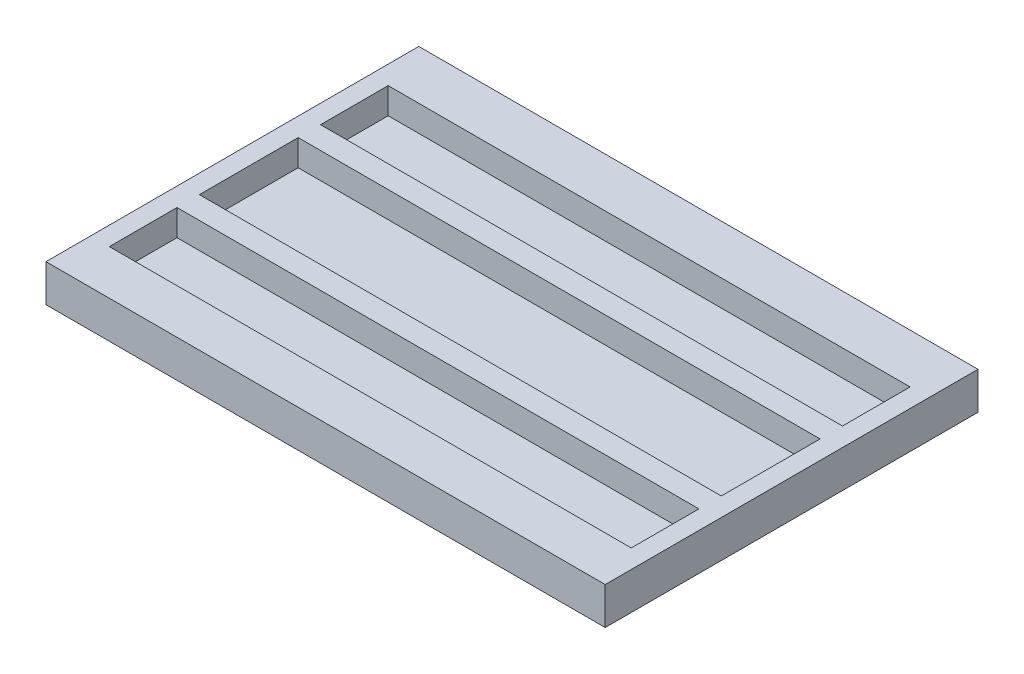
ISO-10303-21;
HEADER;
FILE_DESCRIPTION(('STEP AP214'),'2;1');
FILE_NAME('part.step','',(''),(''),'','','');
FILE_SCHEMA(('AUTOMOTIVE_DESIGN { 1 0 10303 214 1 1 1 1 }'));
ENDSEC;
DATA;
#1=APPLICATION_CONTEXT('core data for automotive mechanical design processes');
#2=APPLICATION_PROTOCOL_DEFINITION('international standard','automotive_design',2000,#1);
#3=PRODUCT_CONTEXT('',#1,'mechanical');
#4=PRODUCT('Part','Part','',(#3));
#5=PRODUCT_RELATED_PRODUCT_CATEGORY('part','',(#4));
#6=PRODUCT_DEFINITION_FORMATION('','',#4);
#7=PRODUCT_DEFINITION_CONTEXT('part definition',#1,'design');
#8=PRODUCT_DEFINITION('design','',#6,#7);
#9=PRODUCT_DEFINITION_SHAPE('','',#8);
#10=(LENGTH_UNIT() NAMED_UNIT(*) SI_UNIT(.MILLI.,.METRE.));
#11=(NAMED_UNIT(*) PLANE_ANGLE_UNIT() SI_UNIT($,.RADIAN.));
#12=(NAMED_UNIT(*) SI_UNIT($,.STERADIAN.) SOLID_ANGLE_UNIT());
#13=UNCERTAINTY_MEASURE_WITH_UNIT(LENGTH_MEASURE(1.E-05),#10,'distance_accuracy_value','');
#14=(GEOMETRIC_REPRESENTATION_CONTEXT(3) GLOBAL_UNCERTAINTY_ASSIGNED_CONTEXT((#13)) GLOBAL_UNIT_ASSIGNED_CONTEXT((#10,
#11,#12)) REPRESENTATION_CONTEXT('',''));
#15=CARTESIAN_POINT('',(0.,0.,0.));
#16=DIRECTION('',(0.,0.,1.));
#17=DIRECTION('',(1.,0.,0.));
#18=AXIS2_PLACEMENT_3D('',#15,#16,#17);
#19=CARTESIAN_POINT('',(75.,10.,-50.));
#20=DIRECTION('',(-1.,0.,0.));
#21=DIRECTION('',(0.,0.,1.));
#22=AXIS2_PLACEMENT_3D('',#19,#20,#21);
#23=PLANE('',#22);
#24=DIRECTION('',(0.,0.,-1.));
#25=VECTOR('',#24,1.);
#26=CARTESIAN_POINT('',(75.,0.,-50.));
#27=LINE('',#26,#25);
#28=CARTESIAN_POINT('',(75.,0.,50.));
#29=VERTEX_POINT('',#28);
#30=CARTESIAN_POINT('',(75.,0.,-50.));
#31=VERTEX_POINT('',#30);
#32=EDGE_CURVE('E190',#29,#31,#27,.T.);
#33=ORIENTED_EDGE('',*,*,#32,.T.);
#34=DIRECTION('',(0.,-1.,0.));
#35=VECTOR('',#34,1.);
#36=CARTESIAN_POINT('',(75.,10.,-50.));
#37=LINE('',#36,#35);
#38=CARTESIAN_POINT('',(75.,10.,-50.));
#39=VERTEX_POINT('',#38);
#40=EDGE_CURVE('E11',#39,#31,#37,.T.);
#41=ORIENTED_EDGE('',*,*,#40,.F.);
#42=DIRECTION('',(0.,0.,-1.));
#43=VECTOR('',#42,1.);
#44=CARTESIAN_POINT('',(75.,10.,-50.));
#45=LINE('',#44,#43);
#46=CARTESIAN_POINT('',(75.,10.,50.));
#47=VERTEX_POINT('',#46);
#48=EDGE_CURVE('E256',#47,#39,#45,.T.);
#49=ORIENTED_EDGE('',*,*,#48,.F.);
#50=DIRECTION('',(0.,-1.,0.));
#51=VECTOR('',#50,1.);
#52=CARTESIAN_POINT('',(75.,10.,50.));
#53=LINE('',#52,#51);
#54=EDGE_CURVE('E266',#47,#29,#53,.T.);
#55=ORIENTED_EDGE('',*,*,#54,.T.);
#56=EDGE_LOOP('',(#33,#41,#49,#55));
#57=FACE_BOUND('',#56,.T.);
#58=ADVANCED_FACE('F43',(#57),#23,.F.);
#59=CARTESIAN_POINT('',(-75.,10.,-50.));
#60=DIRECTION('',(0.,0.,1.));
#61=DIRECTION('',(1.,0.,0.));
#62=AXIS2_PLACEMENT_3D('',#59,#60,#61);
#63=PLANE('',#62);
#64=DIRECTION('',(-1.,0.,0.));
#65=VECTOR('',#64,1.);
#66=CARTESIAN_POINT('',(-75.,0.,-50.));
#67=LINE('',#66,#65);
#68=CARTESIAN_POINT('',(-75.,0.,-50.));
#69=VERTEX_POINT('',#68);
#70=EDGE_CURVE('E269',#31,#69,#67,.T.);
#71=ORIENTED_EDGE('',*,*,#70,.T.);
#72=DIRECTION('',(0.,-1.,0.));
#73=VECTOR('',#72,1.);
#74=CARTESIAN_POINT('',(-75.,10.,-50.));
#75=LINE('',#74,#73);
#76=CARTESIAN_POINT('',(-75.,10.,-50.));
#77=VERTEX_POINT('',#76);
#78=EDGE_CURVE('E50',#77,#69,#75,.T.);
#79=ORIENTED_EDGE('',*,*,#78,.F.);
#80=DIRECTION('',(-1.,0.,0.));
#81=VECTOR('',#80,1.);
#82=CARTESIAN_POINT('',(-75.,10.,-50.));
#83=LINE('',#82,#81);
#84=EDGE_CURVE('E259',#39,#77,#83,.T.);
#85=ORIENTED_EDGE('',*,*,#84,.F.);
#86=ORIENTED_EDGE('',*,*,#40,.T.);
#87=EDGE_LOOP('',(#71,#79,#85,#86));
#88=FACE_BOUND('',#87,.T.);
#89=ADVANCED_FACE('F299',(#88),#63,.F.);
#90=CARTESIAN_POINT('',(-75.,10.,-50.));
#91=DIRECTION('',(1.,0.,0.));
#92=DIRECTION('',(0.,0.,-1.));
#93=AXIS2_PLACEMENT_3D('',#90,#91,#92);
#94=PLANE('',#93);
#95=DIRECTION('',(0.,0.,1.));
#96=VECTOR('',#95,1.);
#97=CARTESIAN_POINT('',(-75.,0.,-50.));
#98=LINE('',#97,#96);
#99=CARTESIAN_POINT('',(-75.,0.,50.));
#100=VERTEX_POINT('',#99);
#101=EDGE_CURVE('E271',#69,#100,#98,.T.);
#102=ORIENTED_EDGE('',*,*,#101,.T.);
#103=DIRECTION('',(0.,-1.,0.));
#104=VECTOR('',#103,1.);
#105=CARTESIAN_POINT('',(-75.,10.,50.));
#106=LINE('',#105,#104);
#107=CARTESIAN_POINT('',(-75.,10.,50.));
#108=VERTEX_POINT('',#107);
#109=EDGE_CURVE('E276',#108,#100,#106,.T.);
#110=ORIENTED_EDGE('',*,*,#109,.F.);
#111=DIRECTION('',(0.,0.,1.));
#112=VECTOR('',#111,1.);
#113=CARTESIAN_POINT('',(-75.,10.,-50.));
#114=LINE('',#113,#112);
#115=EDGE_CURVE('E262',#77,#108,#114,.T.);
#116=ORIENTED_EDGE('',*,*,#115,.F.);
#117=ORIENTED_EDGE('',*,*,#78,.T.);
#118=EDGE_LOOP('',(#102,#110,#116,#117));
#119=FACE_BOUND('',#118,.T.);
#120=ADVANCED_FACE('F283',(#119),#94,.F.);
#121=CARTESIAN_POINT('',(-75.,10.,50.));
#122=DIRECTION('',(0.,0.,-1.));
#123=DIRECTION('',(-1.,0.,0.));
#124=AXIS2_PLACEMENT_3D('',#121,#122,#123);
#125=PLANE('',#124);
#126=DIRECTION('',(1.,0.,0.));
#127=VECTOR('',#126,1.);
#128=CARTESIAN_POINT('',(-75.,0.,50.));
#129=LINE('',#128,#127);
#130=EDGE_CURVE('E260',#100,#29,#129,.T.);
#131=ORIENTED_EDGE('',*,*,#130,.T.);
#132=ORIENTED_EDGE('',*,*,#54,.F.);
#133=DIRECTION('',(1.,0.,0.));
#134=VECTOR('',#133,1.);
#135=CARTESIAN_POINT('',(-75.,10.,50.));
#136=LINE('',#135,#134);
#137=EDGE_CURVE('E264',#108,#47,#136,.T.);
#138=ORIENTED_EDGE('',*,*,#137,.F.);
#139=ORIENTED_EDGE('',*,*,#109,.T.);
#140=EDGE_LOOP('',(#131,#132,#138,#139));
#141=FACE_BOUND('',#140,.T.);
#142=ADVANCED_FACE('F292',(#141),#125,.F.);
#143=CARTESIAN_POINT('',(0.,10.,0.));
#144=DIRECTION('',(0.,1.,0.));
#145=DIRECTION('',(0.,0.,1.));
#146=AXIS2_PLACEMENT_3D('',#143,#144,#145);
#147=PLANE('',#146);
#148=DIRECTION('',(0.,0.,1.));
#149=VECTOR('',#148,1.);
#150=CARTESIAN_POINT('',(-70.,10.,-36.7904647028718));
#151=LINE('',#150,#149);
#152=CARTESIAN_POINT('',(-70.,10.,-36.7904647028718));
#153=VERTEX_POINT('',#152);
#154=CARTESIAN_POINT('',(-70.,10.,-18.6404647028718));
#155=VERTEX_POINT('',#154);
#156=EDGE_CURVE('E57',#153,#155,#151,.T.);
#157=ORIENTED_EDGE('',*,*,#156,.F.);
#158=DIRECTION('',(-1.,0.,0.));
#159=VECTOR('',#158,1.);
#160=CARTESIAN_POINT('',(-70.,10.,-36.7904647028718));
#161=LINE('',#160,#159);
#162=CARTESIAN_POINT('',(70.,10.,-36.7904647028718));
#163=VERTEX_POINT('',#162);
#164=EDGE_CURVE('E175',#163,#153,#161,.T.);
#165=ORIENTED_EDGE('',*,*,#164,.F.);
#166=DIRECTION('',(0.,0.,-1.));
#167=VECTOR('',#166,1.);
#168=CARTESIAN_POINT('',(70.,10.,-36.7904647028718));
#169=LINE('',#168,#167);
#170=CARTESIAN_POINT('',(70.,10.,-18.6404647028718));
#171=VERTEX_POINT('',#170);
#172=EDGE_CURVE('E178',#171,#163,#169,.T.);
#173=ORIENTED_EDGE('',*,*,#172,.F.);
#174=DIRECTION('',(1.,0.,0.));
#175=VECTOR('',#174,1.);
#176=CARTESIAN_POINT('',(-70.,10.,-18.6404647028718));
#177=LINE('',#176,#175);
#178=EDGE_CURVE('E184',#155,#171,#177,.T.);
#179=ORIENTED_EDGE('',*,*,#178,.F.);
#180=EDGE_LOOP('',(#157,#165,#173,#179));
#181=FACE_BOUND('',#180,.T.);
#182=DIRECTION('',(0.,0.,1.));
#183=VECTOR('',#182,1.);
#184=CARTESIAN_POINT('',(-70.,10.,38.0080795521405));
#185=LINE('',#184,#183);
#186=CARTESIAN_POINT('',(-70.,10.,19.8580795521405));
#187=VERTEX_POINT('',#186);
#188=CARTESIAN_POINT('',(-70.,10.,38.0080795521405));
#189=VERTEX_POINT('',#188);
#190=EDGE_CURVE('E65',#187,#189,#185,.T.);
#191=ORIENTED_EDGE('',*,*,#190,.F.);
#192=DIRECTION('',(-1.,0.,0.));
#193=VECTOR('',#192,1.);
#194=CARTESIAN_POINT('',(-70.,10.,19.8580795521405));
#195=LINE('',#194,#193);
#196=CARTESIAN_POINT('',(70.,10.,19.8580795521405));
#197=VERTEX_POINT('',#196);
#198=EDGE_CURVE('E204',#197,#187,#195,.T.);
#199=ORIENTED_EDGE('',*,*,#198,.F.);
#200=DIRECTION('',(0.,0.,-1.));
#201=VECTOR('',#200,1.);
#202=CARTESIAN_POINT('',(70.,10.,38.0080795521405));
#203=LINE('',#202,#201);
#204=CARTESIAN_POINT('',(70.,10.,38.0080795521405));
#205=VERTEX_POINT('',#204);
#206=EDGE_CURVE('E207',#205,#197,#203,.T.);
#207=ORIENTED_EDGE('',*,*,#206,.F.);
#208=DIRECTION('',(1.,0.,0.));
#209=VECTOR('',#208,1.);
#210=CARTESIAN_POINT('',(-70.,10.,38.0080795521405));
#211=LINE('',#210,#209);
#212=EDGE_CURVE('E211',#189,#205,#211,.T.);
#213=ORIENTED_EDGE('',*,*,#212,.F.);
#214=EDGE_LOOP('',(#191,#199,#207,#213));
#215=FACE_BOUND('',#214,.T.);
#216=DIRECTION('',(0.,0.,1.));
#217=VECTOR('',#216,1.);
#218=CARTESIAN_POINT('',(-70.,10.,-12.6404647028718));
#219=LINE('',#218,#217);
#220=CARTESIAN_POINT('',(-70.,10.,-12.6404647028718));
#221=VERTEX_POINT('',#220);
#222=CARTESIAN_POINT('',(-70.,10.,13.8580795521405));
#223=VERTEX_POINT('',#222);
#224=EDGE_CURVE('E203',#221,#223,#219,.T.);
#225=ORIENTED_EDGE('',*,*,#224,.F.);
#226=DIRECTION('',(-1.,0.,0.));
#227=VECTOR('',#226,1.);
#228=CARTESIAN_POINT('',(-70.,10.,-12.6404647028718));
#229=LINE('',#228,#227);
#230=CARTESIAN_POINT('',(70.,10.,-12.6404647028718));
#231=VERTEX_POINT('',#230);
#232=EDGE_CURVE('E235',#231,#221,#229,.T.);
#233=ORIENTED_EDGE('',*,*,#232,.F.);
#234=DIRECTION('',(0.,0.,-1.));
#235=VECTOR('',#234,1.);
#236=CARTESIAN_POINT('',(70.,10.,-12.6404647028718));
#237=LINE('',#236,#235);
#238=CARTESIAN_POINT('',(70.,10.,13.8580795521405));
#239=VERTEX_POINT('',#238);
#240=EDGE_CURVE('E238',#239,#231,#237,.T.);
#241=ORIENTED_EDGE('',*,*,#240,.F.);
#242=DIRECTION('',(1.,0.,0.));
#243=VECTOR('',#242,1.);
#244=CARTESIAN_POINT('',(-70.,10.,13.8580795521405));
#245=LINE('',#244,#243);
#246=EDGE_CURVE('E242',#223,#239,#245,.T.);
#247=ORIENTED_EDGE('',*,*,#246,.F.);
#248=EDGE_LOOP('',(#225,#233,#241,#247));
#249=FACE_BOUND('',#248,.T.);
#250=ORIENTED_EDGE('',*,*,#48,.T.);
#251=ORIENTED_EDGE('',*,*,#84,.T.);
#252=ORIENTED_EDGE('',*,*,#115,.T.);
#253=ORIENTED_EDGE('',*,*,#137,.T.);
#254=EDGE_LOOP('',(#250,#251,#252,#253));
#255=FACE_BOUND('',#254,.T.);
#256=ADVANCED_FACE('F298',(#181,#215,#249,#255),#147,.T.);
#257=CARTESIAN_POINT('',(0.,0.,0.));
#258=DIRECTION('',(0.,1.,0.));
#259=DIRECTION('',(0.,0.,1.));
#260=AXIS2_PLACEMENT_3D('',#257,#258,#259);
#261=PLANE('',#260);
#262=ORIENTED_EDGE('',*,*,#32,.F.);
#263=ORIENTED_EDGE('',*,*,#130,.F.);
#264=ORIENTED_EDGE('',*,*,#101,.F.);
#265=ORIENTED_EDGE('',*,*,#70,.F.);
#266=EDGE_LOOP('',(#262,#263,#264,#265));
#267=FACE_BOUND('',#266,.T.);
#268=ADVANCED_FACE('F289',(#267),#261,.F.);
#269=CARTESIAN_POINT('',(-70.,3.,-12.6404647028718));
#270=DIRECTION('',(-1.,0.,0.));
#271=DIRECTION('',(0.,0.,1.));
#272=AXIS2_PLACEMENT_3D('',#269,#270,#271);
#273=PLANE('',#272);
#274=ORIENTED_EDGE('',*,*,#224,.T.);
#275=DIRECTION('',(0.,1.,0.));
#276=VECTOR('',#275,1.);
#277=CARTESIAN_POINT('',(-70.,3.,13.8580795521405));
#278=LINE('',#277,#276);
#279=CARTESIAN_POINT('',(-70.,3.,13.8580795521405));
#280=VERTEX_POINT('',#279);
#281=EDGE_CURVE('E225',#280,#223,#278,.T.);
#282=ORIENTED_EDGE('',*,*,#281,.F.);
#283=DIRECTION('',(0.,0.,1.));
#284=VECTOR('',#283,1.);
#285=CARTESIAN_POINT('',(-70.,3.,-12.6404647028718));
#286=LINE('',#285,#284);
#287=CARTESIAN_POINT('',(-70.,3.,-12.6404647028718));
#288=VERTEX_POINT('',#287);
#289=EDGE_CURVE('E239',#288,#280,#286,.T.);
#290=ORIENTED_EDGE('',*,*,#289,.F.);
#291=DIRECTION('',(0.,1.,0.));
#292=VECTOR('',#291,1.);
#293=CARTESIAN_POINT('',(-70.,3.,-12.6404647028718));
#294=LINE('',#293,#292);
#295=EDGE_CURVE('E233',#288,#221,#294,.T.);
#296=ORIENTED_EDGE('',*,*,#295,.T.);
#297=EDGE_LOOP('',(#274,#282,#290,#296));
#298=FACE_BOUND('',#297,.T.);
#299=ADVANCED_FACE('F311',(#298),#273,.F.);
#300=CARTESIAN_POINT('',(-70.,3.,-12.6404647028718));
#301=DIRECTION('',(0.,0.,-1.));
#302=DIRECTION('',(-1.,0.,0.));
#303=AXIS2_PLACEMENT_3D('',#300,#301,#302);
#304=PLANE('',#303);
#305=ORIENTED_EDGE('',*,*,#232,.T.);
#306=ORIENTED_EDGE('',*,*,#295,.F.);
#307=DIRECTION('',(-1.,0.,0.));
#308=VECTOR('',#307,1.);
#309=CARTESIAN_POINT('',(-70.,3.,-12.6404647028718));
#310=LINE('',#309,#308);
#311=CARTESIAN_POINT('',(70.,3.,-12.6404647028718));
#312=VERTEX_POINT('',#311);
#313=EDGE_CURVE('E228',#312,#288,#310,.T.);
#314=ORIENTED_EDGE('',*,*,#313,.F.);
#315=DIRECTION('',(0.,1.,0.));
#316=VECTOR('',#315,1.);
#317=CARTESIAN_POINT('',(70.,3.,-12.6404647028718));
#318=LINE('',#317,#316);
#319=EDGE_CURVE('E231',#312,#231,#318,.T.);
#320=ORIENTED_EDGE('',*,*,#319,.T.);
#321=EDGE_LOOP('',(#305,#306,#314,#320));
#322=FACE_BOUND('',#321,.T.);
#323=ADVANCED_FACE('F321',(#322),#304,.F.);
#324=CARTESIAN_POINT('',(70.,3.,-12.6404647028718));
#325=DIRECTION('',(1.,0.,0.));
#326=DIRECTION('',(0.,0.,-1.));
#327=AXIS2_PLACEMENT_3D('',#324,#325,#326);
#328=PLANE('',#327);
#329=ORIENTED_EDGE('',*,*,#240,.T.);
#330=ORIENTED_EDGE('',*,*,#319,.F.);
#331=DIRECTION('',(0.,0.,-1.));
#332=VECTOR('',#331,1.);
#333=CARTESIAN_POINT('',(70.,3.,-12.6404647028718));
#334=LINE('',#333,#332);
#335=CARTESIAN_POINT('',(70.,3.,13.8580795521405));
#336=VERTEX_POINT('',#335);
#337=EDGE_CURVE('E248',#336,#312,#334,.T.);
#338=ORIENTED_EDGE('',*,*,#337,.F.);
#339=DIRECTION('',(0.,1.,0.));
#340=VECTOR('',#339,1.);
#341=CARTESIAN_POINT('',(70.,3.,13.8580795521405));
#342=LINE('',#341,#340);
#343=EDGE_CURVE('E229',#336,#239,#342,.T.);
#344=ORIENTED_EDGE('',*,*,#343,.T.);
#345=EDGE_LOOP('',(#329,#330,#338,#344));
#346=FACE_BOUND('',#345,.T.);
#347=ADVANCED_FACE('F324',(#346),#328,.F.);
#348=CARTESIAN_POINT('',(-70.,3.,13.8580795521405));
#349=DIRECTION('',(0.,0.,1.));
#350=DIRECTION('',(1.,0.,0.));
#351=AXIS2_PLACEMENT_3D('',#348,#349,#350);
#352=PLANE('',#351);
#353=ORIENTED_EDGE('',*,*,#246,.T.);
#354=ORIENTED_EDGE('',*,*,#343,.F.);
#355=DIRECTION('',(1.,0.,0.));
#356=VECTOR('',#355,1.);
#357=CARTESIAN_POINT('',(-70.,3.,13.8580795521405));
#358=LINE('',#357,#356);
#359=EDGE_CURVE('E251',#280,#336,#358,.T.);
#360=ORIENTED_EDGE('',*,*,#359,.F.);
#361=ORIENTED_EDGE('',*,*,#281,.T.);
#362=EDGE_LOOP('',(#353,#354,#360,#361));
#363=FACE_BOUND('',#362,.T.);
#364=ADVANCED_FACE('F319',(#363),#352,.F.);
#365=CARTESIAN_POINT('',(0.,3.,0.));
#366=DIRECTION('',(0.,1.,0.));
#367=DIRECTION('',(0.,0.,1.));
#368=AXIS2_PLACEMENT_3D('',#365,#366,#367);
#369=PLANE('',#368);
#370=ORIENTED_EDGE('',*,*,#289,.T.);
#371=ORIENTED_EDGE('',*,*,#359,.T.);
#372=ORIENTED_EDGE('',*,*,#337,.T.);
#373=ORIENTED_EDGE('',*,*,#313,.T.);
#374=EDGE_LOOP('',(#370,#371,#372,#373));
#375=FACE_BOUND('',#374,.T.);
#376=ADVANCED_FACE('F315',(#375),#369,.T.);
#377=CARTESIAN_POINT('',(-70.,3.,38.0080795521405));
#378=DIRECTION('',(-1.,0.,0.));
#379=DIRECTION('',(0.,0.,1.));
#380=AXIS2_PLACEMENT_3D('',#377,#378,#379);
#381=PLANE('',#380);
#382=ORIENTED_EDGE('',*,*,#190,.T.);
#383=DIRECTION('',(0.,1.,0.));
#384=VECTOR('',#383,1.);
#385=CARTESIAN_POINT('',(-70.,3.,38.0080795521405));
#386=LINE('',#385,#384);
#387=CARTESIAN_POINT('',(-70.,3.,38.0080795521405));
#388=VERTEX_POINT('',#387);
#389=EDGE_CURVE('E194',#388,#189,#386,.T.);
#390=ORIENTED_EDGE('',*,*,#389,.F.);
#391=DIRECTION('',(0.,0.,1.));
#392=VECTOR('',#391,1.);
#393=CARTESIAN_POINT('',(-70.,3.,38.0080795521405));
#394=LINE('',#393,#392);
#395=CARTESIAN_POINT('',(-70.,3.,19.8580795521405));
#396=VERTEX_POINT('',#395);
#397=EDGE_CURVE('E208',#396,#388,#394,.T.);
#398=ORIENTED_EDGE('',*,*,#397,.F.);
#399=DIRECTION('',(0.,1.,0.));
#400=VECTOR('',#399,1.);
#401=CARTESIAN_POINT('',(-70.,3.,19.8580795521405));
#402=LINE('',#401,#400);
#403=EDGE_CURVE('E201',#396,#187,#402,.T.);
#404=ORIENTED_EDGE('',*,*,#403,.T.);
#405=EDGE_LOOP('',(#382,#390,#398,#404));
#406=FACE_BOUND('',#405,.T.);
#407=ADVANCED_FACE('F318',(#406),#381,.F.);
#408=CARTESIAN_POINT('',(-70.,3.,19.8580795521405));
#409=DIRECTION('',(0.,0.,-1.));
#410=DIRECTION('',(-1.,0.,0.));
#411=AXIS2_PLACEMENT_3D('',#408,#409,#410);
#412=PLANE('',#411);
#413=ORIENTED_EDGE('',*,*,#198,.T.);
#414=ORIENTED_EDGE('',*,*,#403,.F.);
#415=DIRECTION('',(-1.,0.,0.));
#416=VECTOR('',#415,1.);
#417=CARTESIAN_POINT('',(-70.,3.,19.8580795521405));
#418=LINE('',#417,#416);
#419=CARTESIAN_POINT('',(70.,3.,19.8580795521405));
#420=VERTEX_POINT('',#419);
#421=EDGE_CURVE('E196',#420,#396,#418,.T.);
#422=ORIENTED_EDGE('',*,*,#421,.F.);
#423=DIRECTION('',(0.,1.,0.));
#424=VECTOR('',#423,1.);
#425=CARTESIAN_POINT('',(70.,3.,19.8580795521405));
#426=LINE('',#425,#424);
#427=EDGE_CURVE('E199',#420,#197,#426,.T.);
#428=ORIENTED_EDGE('',*,*,#427,.T.);
#429=EDGE_LOOP('',(#413,#414,#422,#428));
#430=FACE_BOUND('',#429,.T.);
#431=ADVANCED_FACE('F340',(#430),#412,.F.);
#432=CARTESIAN_POINT('',(70.,3.,38.0080795521405));
#433=DIRECTION('',(1.,0.,0.));
#434=DIRECTION('',(0.,0.,-1.));
#435=AXIS2_PLACEMENT_3D('',#432,#433,#434);
#436=PLANE('',#435);
#437=ORIENTED_EDGE('',*,*,#206,.T.);
#438=ORIENTED_EDGE('',*,*,#427,.F.);
#439=DIRECTION('',(0.,0.,-1.));
#440=VECTOR('',#439,1.);
#441=CARTESIAN_POINT('',(70.,3.,38.0080795521405));
#442=LINE('',#441,#440);
#443=CARTESIAN_POINT('',(70.,3.,38.0080795521405));
#444=VERTEX_POINT('',#443);
#445=EDGE_CURVE('E217',#444,#420,#442,.T.);
#446=ORIENTED_EDGE('',*,*,#445,.F.);
#447=DIRECTION('',(0.,1.,0.));
#448=VECTOR('',#447,1.);
#449=CARTESIAN_POINT('',(70.,3.,38.0080795521405));
#450=LINE('',#449,#448);
#451=EDGE_CURVE('E197',#444,#205,#450,.T.);
#452=ORIENTED_EDGE('',*,*,#451,.T.);
#453=EDGE_LOOP('',(#437,#438,#446,#452));
#454=FACE_BOUND('',#453,.T.);
#455=ADVANCED_FACE('F343',(#454),#436,.F.);
#456=CARTESIAN_POINT('',(-70.,3.,38.0080795521405));
#457=DIRECTION('',(0.,0.,1.));
#458=DIRECTION('',(1.,0.,0.));
#459=AXIS2_PLACEMENT_3D('',#456,#457,#458);
#460=PLANE('',#459);
#461=ORIENTED_EDGE('',*,*,#212,.T.);
#462=ORIENTED_EDGE('',*,*,#451,.F.);
#463=DIRECTION('',(1.,0.,0.));
#464=VECTOR('',#463,1.);
#465=CARTESIAN_POINT('',(-70.,3.,38.0080795521405));
#466=LINE('',#465,#464);
#467=EDGE_CURVE('E220',#388,#444,#466,.T.);
#468=ORIENTED_EDGE('',*,*,#467,.F.);
#469=ORIENTED_EDGE('',*,*,#389,.T.);
#470=EDGE_LOOP('',(#461,#462,#468,#469));
#471=FACE_BOUND('',#470,.T.);
#472=ADVANCED_FACE('F338',(#471),#460,.F.);
#473=CARTESIAN_POINT('',(0.,3.,0.));
#474=DIRECTION('',(0.,-1.,0.));
#475=DIRECTION('',(0.,0.,-1.));
#476=AXIS2_PLACEMENT_3D('',#473,#474,#475);
#477=PLANE('',#476);
#478=ORIENTED_EDGE('',*,*,#397,.T.);
#479=ORIENTED_EDGE('',*,*,#467,.T.);
#480=ORIENTED_EDGE('',*,*,#445,.T.);
#481=ORIENTED_EDGE('',*,*,#421,.T.);
#482=EDGE_LOOP('',(#478,#479,#480,#481));
#483=FACE_BOUND('',#482,.T.);
#484=ADVANCED_FACE('F335',(#483),#477,.F.);
#485=CARTESIAN_POINT('',(-70.,3.,-36.7904647028718));
#486=DIRECTION('',(-1.,0.,0.));
#487=DIRECTION('',(0.,0.,1.));
#488=AXIS2_PLACEMENT_3D('',#485,#486,#487);
#489=PLANE('',#488);
#490=ORIENTED_EDGE('',*,*,#156,.T.);
#491=DIRECTION('',(0.,1.,0.));
#492=VECTOR('',#491,1.);
#493=CARTESIAN_POINT('',(-70.,3.,-18.6404647028718));
#494=LINE('',#493,#492);
#495=CARTESIAN_POINT('',(-70.,3.,-18.6404647028718));
#496=VERTEX_POINT('',#495);
#497=EDGE_CURVE('E153',#496,#155,#494,.T.);
#498=ORIENTED_EDGE('',*,*,#497,.F.);
#499=DIRECTION('',(0.,0.,1.));
#500=VECTOR('',#499,1.);
#501=CARTESIAN_POINT('',(-70.,3.,-36.7904647028718));
#502=LINE('',#501,#500);
#503=CARTESIAN_POINT('',(-70.,3.,-36.7904647028718));
#504=VERTEX_POINT('',#503);
#505=EDGE_CURVE('E157',#504,#496,#502,.T.);
#506=ORIENTED_EDGE('',*,*,#505,.F.);
#507=DIRECTION('',(0.,1.,0.));
#508=VECTOR('',#507,1.);
#509=CARTESIAN_POINT('',(-70.,3.,-36.7904647028718));
#510=LINE('',#509,#508);
#511=EDGE_CURVE('E188',#504,#153,#510,.T.);
#512=ORIENTED_EDGE('',*,*,#511,.T.);
#513=EDGE_LOOP('',(#490,#498,#506,#512));
#514=FACE_BOUND('',#513,.T.);
#515=ADVANCED_FACE('F155',(#514),#489,.F.);
#516=CARTESIAN_POINT('',(-70.,3.,-36.7904647028718));
#517=DIRECTION('',(0.,0.,-1.));
#518=DIRECTION('',(-1.,0.,0.));
#519=AXIS2_PLACEMENT_3D('',#516,#517,#518);
#520=PLANE('',#519);
#521=ORIENTED_EDGE('',*,*,#164,.T.);
#522=ORIENTED_EDGE('',*,*,#511,.F.);
#523=DIRECTION('',(-1.,0.,0.));
#524=VECTOR('',#523,1.);
#525=CARTESIAN_POINT('',(-70.,3.,-36.7904647028718));
#526=LINE('',#525,#524);
#527=CARTESIAN_POINT('',(70.,3.,-36.7904647028718));
#528=VERTEX_POINT('',#527);
#529=EDGE_CURVE('E163',#528,#504,#526,.T.);
#530=ORIENTED_EDGE('',*,*,#529,.F.);
#531=DIRECTION('',(0.,1.,0.));
#532=VECTOR('',#531,1.);
#533=CARTESIAN_POINT('',(70.,3.,-36.7904647028718));
#534=LINE('',#533,#532);
#535=EDGE_CURVE('E191',#528,#163,#534,.T.);
#536=ORIENTED_EDGE('',*,*,#535,.T.);
#537=EDGE_LOOP('',(#521,#522,#530,#536));
#538=FACE_BOUND('',#537,.T.);
#539=ADVANCED_FACE('F355',(#538),#520,.F.);
#540=CARTESIAN_POINT('',(70.,3.,-36.7904647028718));
#541=DIRECTION('',(1.,0.,0.));
#542=DIRECTION('',(0.,0.,-1.));
#543=AXIS2_PLACEMENT_3D('',#540,#541,#542);
#544=PLANE('',#543);
#545=ORIENTED_EDGE('',*,*,#172,.T.);
#546=ORIENTED_EDGE('',*,*,#535,.F.);
#547=DIRECTION('',(0.,0.,-1.));
#548=VECTOR('',#547,1.);
#549=CARTESIAN_POINT('',(70.,3.,-36.7904647028718));
#550=LINE('',#549,#548);
#551=CARTESIAN_POINT('',(70.,3.,-18.6404647028718));
#552=VERTEX_POINT('',#551);
#553=EDGE_CURVE('E171',#552,#528,#550,.T.);
#554=ORIENTED_EDGE('',*,*,#553,.F.);
#555=DIRECTION('',(0.,1.,0.));
#556=VECTOR('',#555,1.);
#557=CARTESIAN_POINT('',(70.,3.,-18.6404647028718));
#558=LINE('',#557,#556);
#559=EDGE_CURVE('E162',#552,#171,#558,.T.);
#560=ORIENTED_EDGE('',*,*,#559,.T.);
#561=EDGE_LOOP('',(#545,#546,#554,#560));
#562=FACE_BOUND('',#561,.T.);
#563=ADVANCED_FACE('F358',(#562),#544,.F.);
#564=CARTESIAN_POINT('',(-70.,3.,-18.6404647028718));
#565=DIRECTION('',(0.,0.,1.));
#566=DIRECTION('',(1.,0.,0.));
#567=AXIS2_PLACEMENT_3D('',#564,#565,#566);
#568=PLANE('',#567);
#569=ORIENTED_EDGE('',*,*,#178,.T.);
#570=ORIENTED_EDGE('',*,*,#559,.F.);
#571=DIRECTION('',(1.,0.,0.));
#572=VECTOR('',#571,1.);
#573=CARTESIAN_POINT('',(-70.,3.,-18.6404647028718));
#574=LINE('',#573,#572);
#575=EDGE_CURVE('E166',#496,#552,#574,.T.);
#576=ORIENTED_EDGE('',*,*,#575,.F.);
#577=ORIENTED_EDGE('',*,*,#497,.T.);
#578=EDGE_LOOP('',(#569,#570,#576,#577));
#579=FACE_BOUND('',#578,.T.);
#580=ADVANCED_FACE('F167',(#579),#568,.F.);
#581=CARTESIAN_POINT('',(0.,3.,0.));
#582=DIRECTION('',(0.,1.,0.));
#583=DIRECTION('',(0.,0.,1.));
#584=AXIS2_PLACEMENT_3D('',#581,#582,#583);
#585=PLANE('',#584);
#586=ORIENTED_EDGE('',*,*,#505,.T.);
#587=ORIENTED_EDGE('',*,*,#575,.T.);
#588=ORIENTED_EDGE('',*,*,#553,.T.);
#589=ORIENTED_EDGE('',*,*,#529,.T.);
#590=EDGE_LOOP('',(#586,#587,#588,#589));
#591=FACE_BOUND('',#590,.T.);
#592=ADVANCED_FACE('F173',(#591),#585,.T.);
#593=CLOSED_SHELL('',(#58,#89,#120,#142,#256,#268,#299,#323,#347,#364,#376,#407,#431,#455,#472,
#484,#515,#539,#563,#580,#592));
#594=MANIFOLD_SOLID_BREP('B2',#593);
#595=ADVANCED_BREP_SHAPE_REPRESENTATION('',(#18,#594),#14);
#596=SHAPE_DEFINITION_REPRESENTATION(#9,#595);
ENDSEC;
END-ISO-10303-21;
